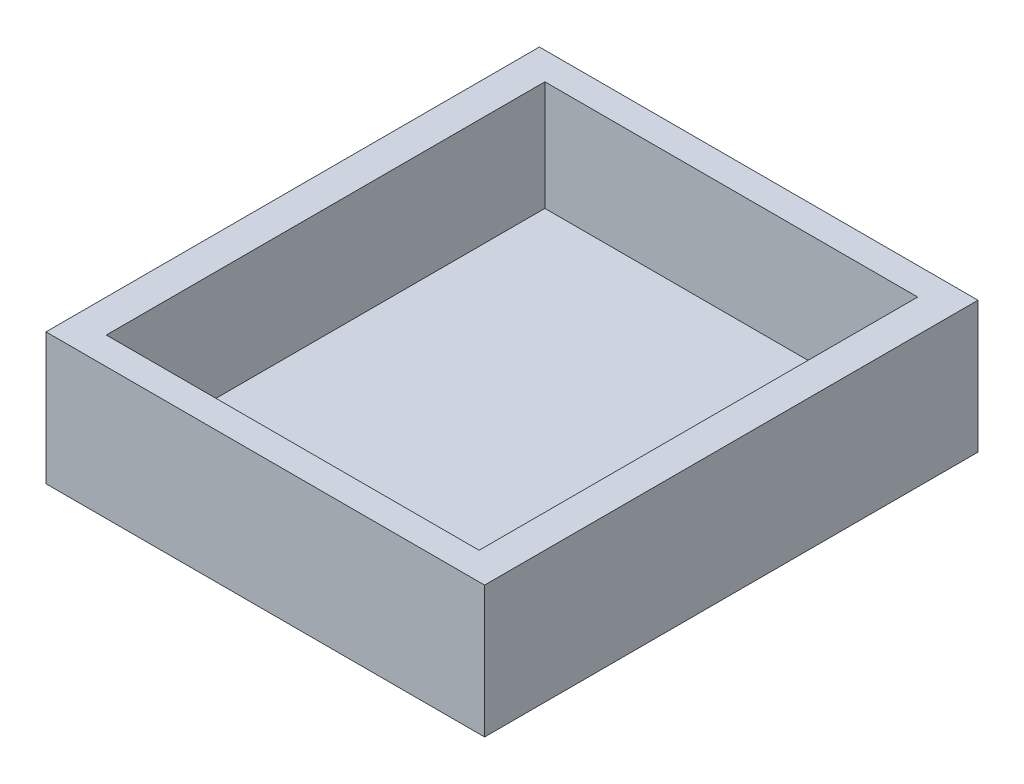
ISO-10303-21;
HEADER;
FILE_DESCRIPTION(('STEP AP214'),'2;1');
FILE_NAME('part.step','',(''),(''),'','','');
FILE_SCHEMA(('AUTOMOTIVE_DESIGN { 1 0 10303 214 1 1 1 1 }'));
ENDSEC;
DATA;
#1=APPLICATION_CONTEXT('core data for automotive mechanical design processes');
#2=APPLICATION_PROTOCOL_DEFINITION('international standard','automotive_design',2000,#1);
#3=PRODUCT_CONTEXT('',#1,'mechanical');
#4=PRODUCT('Part','Part','',(#3));
#5=PRODUCT_RELATED_PRODUCT_CATEGORY('part','',(#4));
#6=PRODUCT_DEFINITION_FORMATION('','',#4);
#7=PRODUCT_DEFINITION_CONTEXT('part definition',#1,'design');
#8=PRODUCT_DEFINITION('design','',#6,#7);
#9=PRODUCT_DEFINITION_SHAPE('','',#8);
#10=(LENGTH_UNIT() NAMED_UNIT(*) SI_UNIT(.MILLI.,.METRE.));
#11=(NAMED_UNIT(*) PLANE_ANGLE_UNIT() SI_UNIT($,.RADIAN.));
#12=(NAMED_UNIT(*) SI_UNIT($,.STERADIAN.) SOLID_ANGLE_UNIT());
#13=UNCERTAINTY_MEASURE_WITH_UNIT(LENGTH_MEASURE(1.E-05),#10,'distance_accuracy_value','');
#14=(GEOMETRIC_REPRESENTATION_CONTEXT(3) GLOBAL_UNCERTAINTY_ASSIGNED_CONTEXT((#13)) GLOBAL_UNIT_ASSIGNED_CONTEXT((#10,
#11,#12)) REPRESENTATION_CONTEXT('',''));
#15=CARTESIAN_POINT('',(0.,0.,0.));
#16=DIRECTION('',(0.,0.,1.));
#17=DIRECTION('',(1.,0.,0.));
#18=AXIS2_PLACEMENT_3D('',#15,#16,#17);
#19=CARTESIAN_POINT('',(0.,12.,0.));
#20=DIRECTION('',(1.,0.,0.));
#21=DIRECTION('',(0.,0.,-1.));
#22=AXIS2_PLACEMENT_3D('',#19,#20,#21);
#23=PLANE('',#22);
#24=DIRECTION('',(0.,0.,1.));
#25=VECTOR('',#24,1.);
#26=CARTESIAN_POINT('',(0.,0.,0.));
#27=LINE('',#26,#25);
#28=CARTESIAN_POINT('',(0.,0.,-45.));
#29=VERTEX_POINT('',#28);
#30=CARTESIAN_POINT('',(0.,0.,0.));
#31=VERTEX_POINT('',#30);
#32=EDGE_CURVE('E144',#29,#31,#27,.T.);
#33=ORIENTED_EDGE('',*,*,#32,.T.);
#34=DIRECTION('',(0.,-1.,0.));
#35=VECTOR('',#34,1.);
#36=CARTESIAN_POINT('',(0.,12.,0.));
#37=LINE('',#36,#35);
#38=CARTESIAN_POINT('',(0.,12.,0.));
#39=VERTEX_POINT('',#38);
#40=EDGE_CURVE('E11',#39,#31,#37,.T.);
#41=ORIENTED_EDGE('',*,*,#40,.F.);
#42=DIRECTION('',(0.,0.,1.));
#43=VECTOR('',#42,1.);
#44=CARTESIAN_POINT('',(0.,12.,0.));
#45=LINE('',#44,#43);
#46=CARTESIAN_POINT('',(0.,12.,-45.));
#47=VERTEX_POINT('',#46);
#48=EDGE_CURVE('E148',#47,#39,#45,.T.);
#49=ORIENTED_EDGE('',*,*,#48,.F.);
#50=DIRECTION('',(0.,-1.,0.));
#51=VECTOR('',#50,1.);
#52=CARTESIAN_POINT('',(0.,12.,-45.));
#53=LINE('',#52,#51);
#54=EDGE_CURVE('E154',#47,#29,#53,.T.);
#55=ORIENTED_EDGE('',*,*,#54,.T.);
#56=EDGE_LOOP('',(#33,#41,#49,#55));
#57=FACE_BOUND('',#56,.T.);
#58=ADVANCED_FACE('F36',(#57),#23,.F.);
#59=CARTESIAN_POINT('',(0.,12.,0.));
#60=DIRECTION('',(0.,0.,-1.));
#61=DIRECTION('',(-1.,0.,0.));
#62=AXIS2_PLACEMENT_3D('',#59,#60,#61);
#63=PLANE('',#62);
#64=DIRECTION('',(1.,0.,0.));
#65=VECTOR('',#64,1.);
#66=CARTESIAN_POINT('',(0.,0.,0.));
#67=LINE('',#66,#65);
#68=CARTESIAN_POINT('',(40.,0.,0.));
#69=VERTEX_POINT('',#68);
#70=EDGE_CURVE('E157',#31,#69,#67,.T.);
#71=ORIENTED_EDGE('',*,*,#70,.T.);
#72=DIRECTION('',(0.,-1.,0.));
#73=VECTOR('',#72,1.);
#74=CARTESIAN_POINT('',(40.,12.,0.));
#75=LINE('',#74,#73);
#76=CARTESIAN_POINT('',(40.,12.,0.));
#77=VERTEX_POINT('',#76);
#78=EDGE_CURVE('E43',#77,#69,#75,.T.);
#79=ORIENTED_EDGE('',*,*,#78,.F.);
#80=DIRECTION('',(1.,0.,0.));
#81=VECTOR('',#80,1.);
#82=CARTESIAN_POINT('',(0.,12.,0.));
#83=LINE('',#82,#81);
#84=EDGE_CURVE('E87',#39,#77,#83,.T.);
#85=ORIENTED_EDGE('',*,*,#84,.F.);
#86=ORIENTED_EDGE('',*,*,#40,.T.);
#87=EDGE_LOOP('',(#71,#79,#85,#86));
#88=FACE_BOUND('',#87,.T.);
#89=ADVANCED_FACE('F186',(#88),#63,.F.);
#90=CARTESIAN_POINT('',(40.,12.,0.));
#91=DIRECTION('',(-1.,0.,0.));
#92=DIRECTION('',(0.,0.,1.));
#93=AXIS2_PLACEMENT_3D('',#90,#91,#92);
#94=PLANE('',#93);
#95=DIRECTION('',(0.,0.,-1.));
#96=VECTOR('',#95,1.);
#97=CARTESIAN_POINT('',(40.,0.,0.));
#98=LINE('',#97,#96);
#99=CARTESIAN_POINT('',(40.,0.,-45.));
#100=VERTEX_POINT('',#99);
#101=EDGE_CURVE('E159',#69,#100,#98,.T.);
#102=ORIENTED_EDGE('',*,*,#101,.T.);
#103=DIRECTION('',(0.,-1.,0.));
#104=VECTOR('',#103,1.);
#105=CARTESIAN_POINT('',(40.,12.,-45.));
#106=LINE('',#105,#104);
#107=CARTESIAN_POINT('',(40.,12.,-45.));
#108=VERTEX_POINT('',#107);
#109=EDGE_CURVE('E163',#108,#100,#106,.T.);
#110=ORIENTED_EDGE('',*,*,#109,.F.);
#111=DIRECTION('',(0.,0.,-1.));
#112=VECTOR('',#111,1.);
#113=CARTESIAN_POINT('',(40.,12.,0.));
#114=LINE('',#113,#112);
#115=EDGE_CURVE('E151',#77,#108,#114,.T.);
#116=ORIENTED_EDGE('',*,*,#115,.F.);
#117=ORIENTED_EDGE('',*,*,#78,.T.);
#118=EDGE_LOOP('',(#102,#110,#116,#117));
#119=FACE_BOUND('',#118,.T.);
#120=ADVANCED_FACE('F168',(#119),#94,.F.);
#121=CARTESIAN_POINT('',(0.,12.,-45.));
#122=DIRECTION('',(0.,0.,1.));
#123=DIRECTION('',(1.,0.,0.));
#124=AXIS2_PLACEMENT_3D('',#121,#122,#123);
#125=PLANE('',#124);
#126=DIRECTION('',(-1.,0.,0.));
#127=VECTOR('',#126,1.);
#128=CARTESIAN_POINT('',(0.,0.,-45.));
#129=LINE('',#128,#127);
#130=EDGE_CURVE('E80',#100,#29,#129,.T.);
#131=ORIENTED_EDGE('',*,*,#130,.T.);
#132=ORIENTED_EDGE('',*,*,#54,.F.);
#133=DIRECTION('',(-1.,0.,0.));
#134=VECTOR('',#133,1.);
#135=CARTESIAN_POINT('',(0.,12.,-45.));
#136=LINE('',#135,#134);
#137=EDGE_CURVE('E59',#108,#47,#136,.T.);
#138=ORIENTED_EDGE('',*,*,#137,.F.);
#139=ORIENTED_EDGE('',*,*,#109,.T.);
#140=EDGE_LOOP('',(#131,#132,#138,#139));
#141=FACE_BOUND('',#140,.T.);
#142=ADVANCED_FACE('F176',(#141),#125,.F.);
#143=CARTESIAN_POINT('',(0.,12.,0.));
#144=DIRECTION('',(0.,-1.,0.));
#145=DIRECTION('',(0.,0.,-1.));
#146=AXIS2_PLACEMENT_3D('',#143,#144,#145);
#147=PLANE('',#146);
#148=DIRECTION('',(1.,0.,0.));
#149=VECTOR('',#148,1.);
#150=CARTESIAN_POINT('',(3.00000000000001,12.,-2.5));
#151=LINE('',#150,#149);
#152=CARTESIAN_POINT('',(3.00000000000001,12.,-2.5));
#153=VERTEX_POINT('',#152);
#154=CARTESIAN_POINT('',(37.,12.,-2.5));
#155=VERTEX_POINT('',#154);
#156=EDGE_CURVE('E138',#153,#155,#151,.T.);
#157=ORIENTED_EDGE('',*,*,#156,.F.);
#158=DIRECTION('',(0.,0.,1.));
#159=VECTOR('',#158,1.);
#160=CARTESIAN_POINT('',(3.,12.,-42.5));
#161=LINE('',#160,#159);
#162=CARTESIAN_POINT('',(3.,12.,-42.5));
#163=VERTEX_POINT('',#162);
#164=EDGE_CURVE('E50',#163,#153,#161,.T.);
#165=ORIENTED_EDGE('',*,*,#164,.F.);
#166=DIRECTION('',(-1.,0.,0.));
#167=VECTOR('',#166,1.);
#168=CARTESIAN_POINT('',(3.,12.,-42.5));
#169=LINE('',#168,#167);
#170=CARTESIAN_POINT('',(37.,12.,-42.5));
#171=VERTEX_POINT('',#170);
#172=EDGE_CURVE('E129',#171,#163,#169,.T.);
#173=ORIENTED_EDGE('',*,*,#172,.F.);
#174=DIRECTION('',(0.,0.,-1.));
#175=VECTOR('',#174,1.);
#176=CARTESIAN_POINT('',(37.,12.,-42.5));
#177=LINE('',#176,#175);
#178=EDGE_CURVE('E132',#155,#171,#177,.T.);
#179=ORIENTED_EDGE('',*,*,#178,.F.);
#180=EDGE_LOOP('',(#157,#165,#173,#179));
#181=FACE_BOUND('',#180,.T.);
#182=ORIENTED_EDGE('',*,*,#48,.T.);
#183=ORIENTED_EDGE('',*,*,#84,.T.);
#184=ORIENTED_EDGE('',*,*,#115,.T.);
#185=ORIENTED_EDGE('',*,*,#137,.T.);
#186=EDGE_LOOP('',(#182,#183,#184,#185));
#187=FACE_BOUND('',#186,.T.);
#188=ADVANCED_FACE('F178',(#181,#187),#147,.F.);
#189=CARTESIAN_POINT('',(0.,0.,0.));
#190=DIRECTION('',(0.,-1.,0.));
#191=DIRECTION('',(0.,0.,-1.));
#192=AXIS2_PLACEMENT_3D('',#189,#190,#191);
#193=PLANE('',#192);
#194=ORIENTED_EDGE('',*,*,#32,.F.);
#195=ORIENTED_EDGE('',*,*,#130,.F.);
#196=ORIENTED_EDGE('',*,*,#101,.F.);
#197=ORIENTED_EDGE('',*,*,#70,.F.);
#198=EDGE_LOOP('',(#194,#195,#196,#197));
#199=FACE_BOUND('',#198,.T.);
#200=ADVANCED_FACE('F172',(#199),#193,.T.);
#201=CARTESIAN_POINT('',(3.,2.,-42.5));
#202=DIRECTION('',(-1.,0.,0.));
#203=DIRECTION('',(0.,0.,1.));
#204=AXIS2_PLACEMENT_3D('',#201,#202,#203);
#205=PLANE('',#204);
#206=ORIENTED_EDGE('',*,*,#164,.T.);
#207=DIRECTION('',(0.,1.,0.));
#208=VECTOR('',#207,1.);
#209=CARTESIAN_POINT('',(3.00000000000001,2.,-2.5));
#210=LINE('',#209,#208);
#211=CARTESIAN_POINT('',(3.00000000000001,2.,-2.5));
#212=VERTEX_POINT('',#211);
#213=EDGE_CURVE('E107',#212,#153,#210,.T.);
#214=ORIENTED_EDGE('',*,*,#213,.F.);
#215=DIRECTION('',(0.,0.,1.));
#216=VECTOR('',#215,1.);
#217=CARTESIAN_POINT('',(3.,2.,-42.5));
#218=LINE('',#217,#216);
#219=CARTESIAN_POINT('',(3.,2.,-42.5));
#220=VERTEX_POINT('',#219);
#221=EDGE_CURVE('E111',#220,#212,#218,.T.);
#222=ORIENTED_EDGE('',*,*,#221,.F.);
#223=DIRECTION('',(0.,1.,0.));
#224=VECTOR('',#223,1.);
#225=CARTESIAN_POINT('',(3.,2.,-42.5));
#226=LINE('',#225,#224);
#227=EDGE_CURVE('E142',#220,#163,#226,.T.);
#228=ORIENTED_EDGE('',*,*,#227,.T.);
#229=EDGE_LOOP('',(#206,#214,#222,#228));
#230=FACE_BOUND('',#229,.T.);
#231=ADVANCED_FACE('F109',(#230),#205,.F.);
#232=CARTESIAN_POINT('',(3.,2.,-42.5));
#233=DIRECTION('',(0.,0.,-1.));
#234=DIRECTION('',(-1.,0.,0.));
#235=AXIS2_PLACEMENT_3D('',#232,#233,#234);
#236=PLANE('',#235);
#237=ORIENTED_EDGE('',*,*,#172,.T.);
#238=ORIENTED_EDGE('',*,*,#227,.F.);
#239=DIRECTION('',(-1.,0.,0.));
#240=VECTOR('',#239,1.);
#241=CARTESIAN_POINT('',(3.,2.,-42.5));
#242=LINE('',#241,#240);
#243=CARTESIAN_POINT('',(37.,2.,-42.5));
#244=VERTEX_POINT('',#243);
#245=EDGE_CURVE('E117',#244,#220,#242,.T.);
#246=ORIENTED_EDGE('',*,*,#245,.F.);
#247=DIRECTION('',(0.,1.,0.));
#248=VECTOR('',#247,1.);
#249=CARTESIAN_POINT('',(37.,2.,-42.5));
#250=LINE('',#249,#248);
#251=EDGE_CURVE('E145',#244,#171,#250,.T.);
#252=ORIENTED_EDGE('',*,*,#251,.T.);
#253=EDGE_LOOP('',(#237,#238,#246,#252));
#254=FACE_BOUND('',#253,.T.);
#255=ADVANCED_FACE('F225',(#254),#236,.F.);
#256=CARTESIAN_POINT('',(37.,2.,-42.5));
#257=DIRECTION('',(1.,0.,0.));
#258=DIRECTION('',(0.,0.,-1.));
#259=AXIS2_PLACEMENT_3D('',#256,#257,#258);
#260=PLANE('',#259);
#261=ORIENTED_EDGE('',*,*,#178,.T.);
#262=ORIENTED_EDGE('',*,*,#251,.F.);
#263=DIRECTION('',(0.,0.,-1.));
#264=VECTOR('',#263,1.);
#265=CARTESIAN_POINT('',(37.,2.,-42.5));
#266=LINE('',#265,#264);
#267=CARTESIAN_POINT('',(37.,2.,-2.5));
#268=VERTEX_POINT('',#267);
#269=EDGE_CURVE('E125',#268,#244,#266,.T.);
#270=ORIENTED_EDGE('',*,*,#269,.F.);
#271=DIRECTION('',(0.,1.,0.));
#272=VECTOR('',#271,1.);
#273=CARTESIAN_POINT('',(37.,2.,-2.5));
#274=LINE('',#273,#272);
#275=EDGE_CURVE('E116',#268,#155,#274,.T.);
#276=ORIENTED_EDGE('',*,*,#275,.T.);
#277=EDGE_LOOP('',(#261,#262,#270,#276));
#278=FACE_BOUND('',#277,.T.);
#279=ADVANCED_FACE('F234',(#278),#260,.F.);
#280=CARTESIAN_POINT('',(3.00000000000001,2.,-2.5));
#281=DIRECTION('',(0.,0.,1.));
#282=DIRECTION('',(1.,0.,0.));
#283=AXIS2_PLACEMENT_3D('',#280,#281,#282);
#284=PLANE('',#283);
#285=ORIENTED_EDGE('',*,*,#156,.T.);
#286=ORIENTED_EDGE('',*,*,#275,.F.);
#287=DIRECTION('',(1.,0.,0.));
#288=VECTOR('',#287,1.);
#289=CARTESIAN_POINT('',(3.00000000000001,2.,-2.5));
#290=LINE('',#289,#288);
#291=EDGE_CURVE('E120',#212,#268,#290,.T.);
#292=ORIENTED_EDGE('',*,*,#291,.F.);
#293=ORIENTED_EDGE('',*,*,#213,.T.);
#294=EDGE_LOOP('',(#285,#286,#292,#293));
#295=FACE_BOUND('',#294,.T.);
#296=ADVANCED_FACE('F121',(#295),#284,.F.);
#297=CARTESIAN_POINT('',(0.,2.,0.));
#298=DIRECTION('',(0.,1.,0.));
#299=DIRECTION('',(0.,0.,1.));
#300=AXIS2_PLACEMENT_3D('',#297,#298,#299);
#301=PLANE('',#300);
#302=ORIENTED_EDGE('',*,*,#221,.T.);
#303=ORIENTED_EDGE('',*,*,#291,.T.);
#304=ORIENTED_EDGE('',*,*,#269,.T.);
#305=ORIENTED_EDGE('',*,*,#245,.T.);
#306=EDGE_LOOP('',(#302,#303,#304,#305));
#307=FACE_BOUND('',#306,.T.);
#308=ADVANCED_FACE('F127',(#307),#301,.T.);
#309=CLOSED_SHELL('',(#58,#89,#120,#142,#188,#200,#231,#255,#279,#296,#308));
#310=MANIFOLD_SOLID_BREP('B2',#309);
#311=ADVANCED_BREP_SHAPE_REPRESENTATION('',(#18,#310),#14);
#312=SHAPE_DEFINITION_REPRESENTATION(#9,#311);
ENDSEC;
END-ISO-10303-21;
